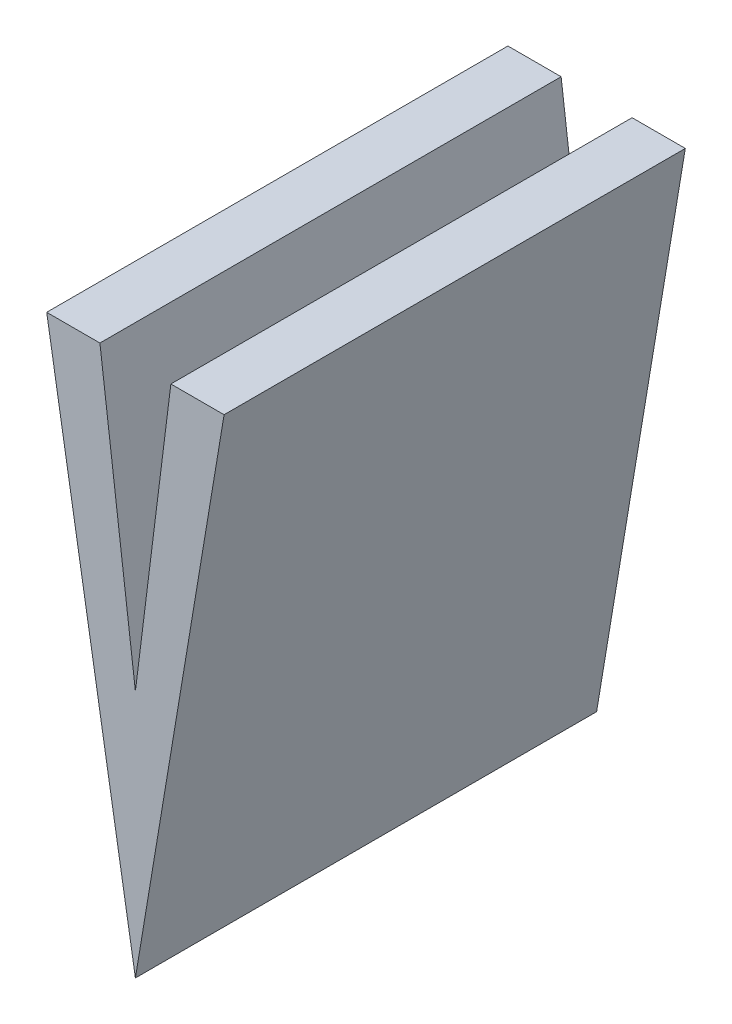
ISO-10303-21;
HEADER;
FILE_DESCRIPTION(('STEP AP214'),'2;1');
FILE_NAME('part.step','',(''),(''),'','','');
FILE_SCHEMA(('AUTOMOTIVE_DESIGN { 1 0 10303 214 1 1 1 1 }'));
ENDSEC;
DATA;
#1=APPLICATION_CONTEXT('core data for automotive mechanical design processes');
#2=APPLICATION_PROTOCOL_DEFINITION('international standard','automotive_design',2000,#1);
#3=PRODUCT_CONTEXT('',#1,'mechanical');
#4=PRODUCT('Part','Part','',(#3));
#5=PRODUCT_RELATED_PRODUCT_CATEGORY('part','',(#4));
#6=PRODUCT_DEFINITION_FORMATION('','',#4);
#7=PRODUCT_DEFINITION_CONTEXT('part definition',#1,'design');
#8=PRODUCT_DEFINITION('design','',#6,#7);
#9=PRODUCT_DEFINITION_SHAPE('','',#8);
#10=(LENGTH_UNIT() NAMED_UNIT(*) SI_UNIT(.MILLI.,.METRE.));
#11=(NAMED_UNIT(*) PLANE_ANGLE_UNIT() SI_UNIT($,.RADIAN.));
#12=(NAMED_UNIT(*) SI_UNIT($,.STERADIAN.) SOLID_ANGLE_UNIT());
#13=UNCERTAINTY_MEASURE_WITH_UNIT(LENGTH_MEASURE(1.E-05),#10,'distance_accuracy_value','');
#14=(GEOMETRIC_REPRESENTATION_CONTEXT(3) GLOBAL_UNCERTAINTY_ASSIGNED_CONTEXT((#13)) GLOBAL_UNIT_ASSIGNED_CONTEXT((#10,
#11,#12)) REPRESENTATION_CONTEXT('',''));
#15=CARTESIAN_POINT('',(0.,0.,0.));
#16=DIRECTION('',(0.,0.,1.));
#17=DIRECTION('',(1.,0.,0.));
#18=AXIS2_PLACEMENT_3D('',#15,#16,#17);
#19=CARTESIAN_POINT('',(0.,30.,26.));
#20=DIRECTION('',(0.,1.,0.));
#21=DIRECTION('',(0.,0.,1.));
#22=AXIS2_PLACEMENT_3D('',#19,#20,#21);
#23=PLANE('',#22);
#24=DIRECTION('',(1.,0.,0.));
#25=VECTOR('',#24,1.);
#26=CARTESIAN_POINT('',(0.,30.,0.));
#27=LINE('',#26,#25);
#28=CARTESIAN_POINT('',(2.,30.,0.));
#29=VERTEX_POINT('',#28);
#30=CARTESIAN_POINT('',(5.,30.,0.));
#31=VERTEX_POINT('',#30);
#32=EDGE_CURVE('E116',#29,#31,#27,.T.);
#33=ORIENTED_EDGE('',*,*,#32,.F.);
#34=DIRECTION('',(0.,0.,-1.));
#35=VECTOR('',#34,1.);
#36=CARTESIAN_POINT('',(2.,30.,26.));
#37=LINE('',#36,#35);
#38=CARTESIAN_POINT('',(2.,30.,26.));
#39=VERTEX_POINT('',#38);
#40=EDGE_CURVE('E11',#39,#29,#37,.T.);
#41=ORIENTED_EDGE('',*,*,#40,.F.);
#42=DIRECTION('',(1.,0.,0.));
#43=VECTOR('',#42,1.);
#44=CARTESIAN_POINT('',(0.,30.,26.));
#45=LINE('',#44,#43);
#46=CARTESIAN_POINT('',(5.,30.,26.));
#47=VERTEX_POINT('',#46);
#48=EDGE_CURVE('E128',#39,#47,#45,.T.);
#49=ORIENTED_EDGE('',*,*,#48,.T.);
#50=DIRECTION('',(0.,0.,-1.));
#51=VECTOR('',#50,1.);
#52=CARTESIAN_POINT('',(5.,30.,26.));
#53=LINE('',#52,#51);
#54=EDGE_CURVE('E50',#47,#31,#53,.T.);
#55=ORIENTED_EDGE('',*,*,#54,.T.);
#56=EDGE_LOOP('',(#33,#41,#49,#55));
#57=FACE_BOUND('',#56,.T.);
#58=ADVANCED_FACE('F34',(#57),#23,.T.);
#59=CARTESIAN_POINT('',(-1.72307692307693,0.215384615384616,26.));
#60=DIRECTION('',(0.992277876713668,-0.124034734589209,0.));
#61=DIRECTION('',(0.124034734589209,0.992277876713668,0.));
#62=AXIS2_PLACEMENT_3D('',#59,#60,#61);
#63=PLANE('',#62);
#64=DIRECTION('',(-0.124034734589209,-0.992277876713668,0.));
#65=VECTOR('',#64,1.);
#66=CARTESIAN_POINT('',(-1.72307692307693,0.215384615384616,0.));
#67=LINE('',#66,#65);
#68=CARTESIAN_POINT('',(0.,14.,0.));
#69=VERTEX_POINT('',#68);
#70=EDGE_CURVE('E118',#29,#69,#67,.T.);
#71=ORIENTED_EDGE('',*,*,#70,.T.);
#72=DIRECTION('',(0.,0.,-1.));
#73=VECTOR('',#72,1.);
#74=CARTESIAN_POINT('',(0.,14.,26.));
#75=LINE('',#74,#73);
#76=CARTESIAN_POINT('',(0.,14.,26.));
#77=VERTEX_POINT('',#76);
#78=EDGE_CURVE('E42',#77,#69,#75,.T.);
#79=ORIENTED_EDGE('',*,*,#78,.F.);
#80=DIRECTION('',(-0.124034734589209,-0.992277876713668,0.));
#81=VECTOR('',#80,1.);
#82=CARTESIAN_POINT('',(-1.72307692307693,0.215384615384616,26.));
#83=LINE('',#82,#81);
#84=EDGE_CURVE('E213',#39,#77,#83,.T.);
#85=ORIENTED_EDGE('',*,*,#84,.F.);
#86=ORIENTED_EDGE('',*,*,#40,.T.);
#87=EDGE_LOOP('',(#71,#79,#85,#86));
#88=FACE_BOUND('',#87,.T.);
#89=ADVANCED_FACE('F151',(#88),#63,.F.);
#90=CARTESIAN_POINT('',(1.72307692307693,0.215384615384616,26.));
#91=DIRECTION('',(-0.992277876713668,-0.124034734589209,0.));
#92=DIRECTION('',(0.124034734589209,-0.992277876713668,0.));
#93=AXIS2_PLACEMENT_3D('',#90,#91,#92);
#94=PLANE('',#93);
#95=DIRECTION('',(-0.124034734589209,0.992277876713668,0.));
#96=VECTOR('',#95,1.);
#97=CARTESIAN_POINT('',(1.72307692307693,0.215384615384616,0.));
#98=LINE('',#97,#96);
#99=CARTESIAN_POINT('',(-2.,30.,0.));
#100=VERTEX_POINT('',#99);
#101=EDGE_CURVE('E120',#69,#100,#98,.T.);
#102=ORIENTED_EDGE('',*,*,#101,.T.);
#103=DIRECTION('',(0.,0.,-1.));
#104=VECTOR('',#103,1.);
#105=CARTESIAN_POINT('',(-2.,30.,26.));
#106=LINE('',#105,#104);
#107=CARTESIAN_POINT('',(-2.,30.,26.));
#108=VERTEX_POINT('',#107);
#109=EDGE_CURVE('E108',#108,#100,#106,.T.);
#110=ORIENTED_EDGE('',*,*,#109,.F.);
#111=DIRECTION('',(-0.124034734589209,0.992277876713668,0.));
#112=VECTOR('',#111,1.);
#113=CARTESIAN_POINT('',(1.72307692307693,0.215384615384616,26.));
#114=LINE('',#113,#112);
#115=EDGE_CURVE('E96',#77,#108,#114,.T.);
#116=ORIENTED_EDGE('',*,*,#115,.F.);
#117=ORIENTED_EDGE('',*,*,#78,.T.);
#118=EDGE_LOOP('',(#102,#110,#116,#117));
#119=FACE_BOUND('',#118,.T.);
#120=ADVANCED_FACE('F135',(#119),#94,.F.);
#121=CARTESIAN_POINT('',(0.,30.,26.));
#122=DIRECTION('',(0.,-1.,0.));
#123=DIRECTION('',(0.,0.,-1.));
#124=AXIS2_PLACEMENT_3D('',#121,#122,#123);
#125=PLANE('',#124);
#126=DIRECTION('',(-1.,0.,0.));
#127=VECTOR('',#126,1.);
#128=CARTESIAN_POINT('',(0.,30.,0.));
#129=LINE('',#128,#127);
#130=CARTESIAN_POINT('',(-5.,30.,0.));
#131=VERTEX_POINT('',#130);
#132=EDGE_CURVE('E105',#100,#131,#129,.T.);
#133=ORIENTED_EDGE('',*,*,#132,.T.);
#134=DIRECTION('',(0.,0.,-1.));
#135=VECTOR('',#134,1.);
#136=CARTESIAN_POINT('',(-5.,30.,26.));
#137=LINE('',#136,#135);
#138=CARTESIAN_POINT('',(-5.,30.,26.));
#139=VERTEX_POINT('',#138);
#140=EDGE_CURVE('E102',#139,#131,#137,.T.);
#141=ORIENTED_EDGE('',*,*,#140,.F.);
#142=DIRECTION('',(-1.,0.,0.));
#143=VECTOR('',#142,1.);
#144=CARTESIAN_POINT('',(0.,30.,26.));
#145=LINE('',#144,#143);
#146=EDGE_CURVE('E88',#108,#139,#145,.T.);
#147=ORIENTED_EDGE('',*,*,#146,.F.);
#148=ORIENTED_EDGE('',*,*,#109,.T.);
#149=EDGE_LOOP('',(#133,#141,#147,#148));
#150=FACE_BOUND('',#149,.T.);
#151=ADVANCED_FACE('F103',(#150),#125,.F.);
#152=CARTESIAN_POINT('',(0.,0.,26.));
#153=DIRECTION('',(0.986393923832144,0.164398987305357,0.));
#154=DIRECTION('',(-0.164398987305357,0.986393923832144,0.));
#155=AXIS2_PLACEMENT_3D('',#152,#153,#154);
#156=PLANE('',#155);
#157=DIRECTION('',(0.164398987305357,-0.986393923832144,0.));
#158=VECTOR('',#157,1.);
#159=CARTESIAN_POINT('',(0.,0.,0.));
#160=LINE('',#159,#158);
#161=CARTESIAN_POINT('',(0.,0.,0.));
#162=VERTEX_POINT('',#161);
#163=EDGE_CURVE('E123',#131,#162,#160,.T.);
#164=ORIENTED_EDGE('',*,*,#163,.T.);
#165=DIRECTION('',(0.,0.,-1.));
#166=VECTOR('',#165,1.);
#167=CARTESIAN_POINT('',(0.,0.,26.));
#168=LINE('',#167,#166);
#169=CARTESIAN_POINT('',(0.,0.,26.));
#170=VERTEX_POINT('',#169);
#171=EDGE_CURVE('E70',#170,#162,#168,.T.);
#172=ORIENTED_EDGE('',*,*,#171,.F.);
#173=DIRECTION('',(0.164398987305357,-0.986393923832144,0.));
#174=VECTOR('',#173,1.);
#175=CARTESIAN_POINT('',(0.,0.,26.));
#176=LINE('',#175,#174);
#177=EDGE_CURVE('E94',#139,#170,#176,.T.);
#178=ORIENTED_EDGE('',*,*,#177,.F.);
#179=ORIENTED_EDGE('',*,*,#140,.T.);
#180=EDGE_LOOP('',(#164,#172,#178,#179));
#181=FACE_BOUND('',#180,.T.);
#182=ADVANCED_FACE('F110',(#181),#156,.F.);
#183=CARTESIAN_POINT('',(0.,0.,26.));
#184=DIRECTION('',(0.986393923832144,-0.164398987305357,0.));
#185=DIRECTION('',(0.164398987305357,0.986393923832144,0.));
#186=AXIS2_PLACEMENT_3D('',#183,#184,#185);
#187=PLANE('',#186);
#188=DIRECTION('',(-0.164398987305357,-0.986393923832144,0.));
#189=VECTOR('',#188,1.);
#190=CARTESIAN_POINT('',(0.,0.,0.));
#191=LINE('',#190,#189);
#192=EDGE_CURVE('E125',#31,#162,#191,.T.);
#193=ORIENTED_EDGE('',*,*,#192,.F.);
#194=ORIENTED_EDGE('',*,*,#54,.F.);
#195=DIRECTION('',(-0.164398987305357,-0.986393923832144,0.));
#196=VECTOR('',#195,1.);
#197=CARTESIAN_POINT('',(0.,0.,26.));
#198=LINE('',#197,#196);
#199=EDGE_CURVE('E111',#47,#170,#198,.T.);
#200=ORIENTED_EDGE('',*,*,#199,.T.);
#201=ORIENTED_EDGE('',*,*,#171,.T.);
#202=EDGE_LOOP('',(#193,#194,#200,#201));
#203=FACE_BOUND('',#202,.T.);
#204=ADVANCED_FACE('F140',(#203),#187,.T.);
#205=CARTESIAN_POINT('',(0.,0.,26.));
#206=DIRECTION('',(0.,0.,1.));
#207=DIRECTION('',(1.,0.,0.));
#208=AXIS2_PLACEMENT_3D('',#205,#206,#207);
#209=PLANE('',#208);
#210=ORIENTED_EDGE('',*,*,#48,.F.);
#211=ORIENTED_EDGE('',*,*,#84,.T.);
#212=ORIENTED_EDGE('',*,*,#115,.T.);
#213=ORIENTED_EDGE('',*,*,#146,.T.);
#214=ORIENTED_EDGE('',*,*,#177,.T.);
#215=ORIENTED_EDGE('',*,*,#199,.F.);
#216=EDGE_LOOP('',(#210,#211,#212,#213,#214,#215));
#217=FACE_BOUND('',#216,.T.);
#218=ADVANCED_FACE('F91',(#217),#209,.T.);
#219=CARTESIAN_POINT('',(0.,0.,0.));
#220=DIRECTION('',(0.,0.,1.));
#221=DIRECTION('',(1.,0.,0.));
#222=AXIS2_PLACEMENT_3D('',#219,#220,#221);
#223=PLANE('',#222);
#224=ORIENTED_EDGE('',*,*,#32,.T.);
#225=ORIENTED_EDGE('',*,*,#192,.T.);
#226=ORIENTED_EDGE('',*,*,#163,.F.);
#227=ORIENTED_EDGE('',*,*,#132,.F.);
#228=ORIENTED_EDGE('',*,*,#101,.F.);
#229=ORIENTED_EDGE('',*,*,#70,.F.);
#230=EDGE_LOOP('',(#224,#225,#226,#227,#228,#229));
#231=FACE_BOUND('',#230,.T.);
#232=ADVANCED_FACE('F139',(#231),#223,.F.);
#233=CLOSED_SHELL('',(#58,#89,#120,#151,#182,#204,#218,#232));
#234=MANIFOLD_SOLID_BREP('B2',#233);
#235=ADVANCED_BREP_SHAPE_REPRESENTATION('',(#18,#234),#14);
#236=SHAPE_DEFINITION_REPRESENTATION(#9,#235);
ENDSEC;
END-ISO-10303-21;
